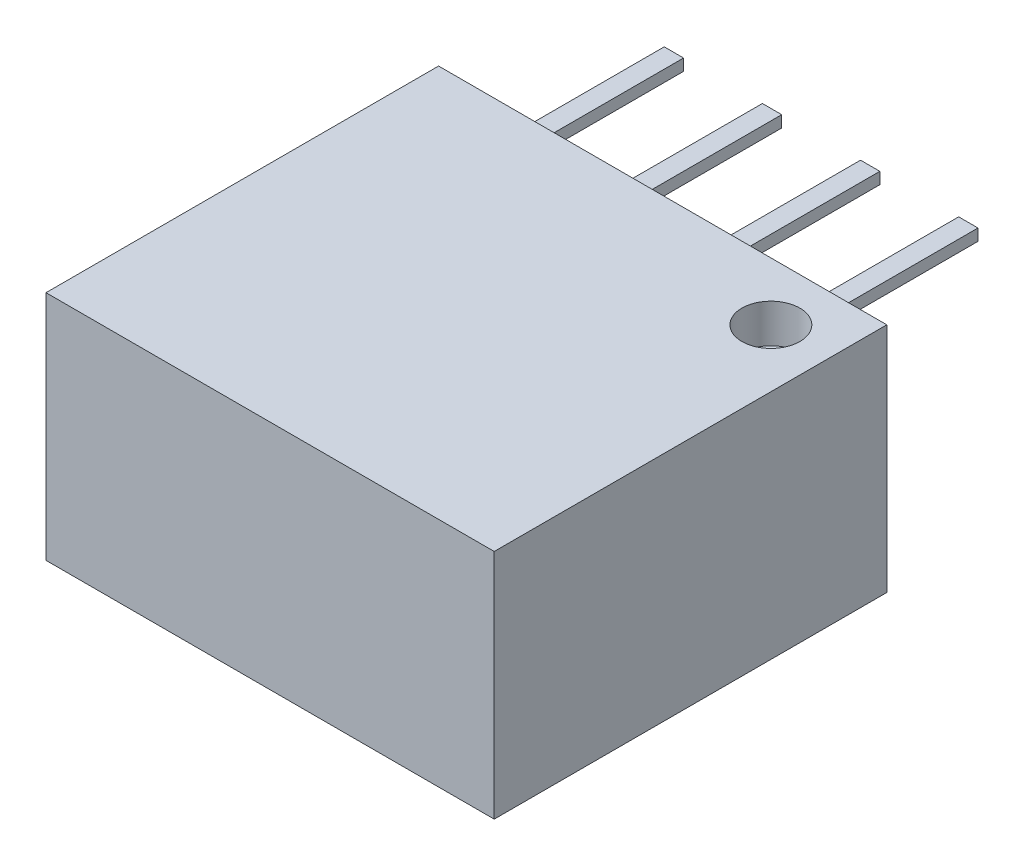
ISO-10303-21;
HEADER;
FILE_DESCRIPTION(('STEP AP214'),'2;1');
FILE_NAME('part.step','',(''),(''),'','','');
FILE_SCHEMA(('AUTOMOTIVE_DESIGN { 1 0 10303 214 1 1 1 1 }'));
ENDSEC;
DATA;
#1=APPLICATION_CONTEXT('core data for automotive mechanical design processes');
#2=APPLICATION_PROTOCOL_DEFINITION('international standard','automotive_design',2000,#1);
#3=PRODUCT_CONTEXT('',#1,'mechanical');
#4=PRODUCT('Part','Part','',(#3));
#5=PRODUCT_RELATED_PRODUCT_CATEGORY('part','',(#4));
#6=PRODUCT_DEFINITION_FORMATION('','',#4);
#7=PRODUCT_DEFINITION_CONTEXT('part definition',#1,'design');
#8=PRODUCT_DEFINITION('design','',#6,#7);
#9=PRODUCT_DEFINITION_SHAPE('','',#8);
#10=(LENGTH_UNIT() NAMED_UNIT(*) SI_UNIT(.MILLI.,.METRE.));
#11=(NAMED_UNIT(*) PLANE_ANGLE_UNIT() SI_UNIT($,.RADIAN.));
#12=(NAMED_UNIT(*) SI_UNIT($,.STERADIAN.) SOLID_ANGLE_UNIT());
#13=UNCERTAINTY_MEASURE_WITH_UNIT(LENGTH_MEASURE(1.E-05),#10,'distance_accuracy_value','');
#14=(GEOMETRIC_REPRESENTATION_CONTEXT(3) GLOBAL_UNCERTAINTY_ASSIGNED_CONTEXT((#13)) GLOBAL_UNIT_ASSIGNED_CONTEXT((#10,
#11,#12)) REPRESENTATION_CONTEXT('',''));
#15=CARTESIAN_POINT('',(0.,0.,0.));
#16=DIRECTION('',(0.,0.,1.));
#17=DIRECTION('',(1.,0.,0.));
#18=AXIS2_PLACEMENT_3D('',#15,#16,#17);
#19=CARTESIAN_POINT('',(-3.56,2.25,-4.1));
#20=DIRECTION('',(0.,-1.,0.));
#21=DIRECTION('',(0.,0.,-1.));
#22=AXIS2_PLACEMENT_3D('',#19,#20,#21);
#23=PLANE('',#22);
#24=DIRECTION('',(1.,0.,0.));
#25=VECTOR('',#24,1.);
#26=CARTESIAN_POINT('',(-3.56,2.25,0.));
#27=LINE('',#26,#25);
#28=CARTESIAN_POINT('',(-4.06,2.25,0.));
#29=VERTEX_POINT('',#28);
#30=CARTESIAN_POINT('',(-3.56,2.25,0.));
#31=VERTEX_POINT('',#30);
#32=EDGE_CURVE('E12',#29,#31,#27,.T.);
#33=ORIENTED_EDGE('',*,*,#32,.T.);
#34=DIRECTION('',(0.,0.,1.));
#35=VECTOR('',#34,1.);
#36=CARTESIAN_POINT('',(-3.56,2.25,-4.1));
#37=LINE('',#36,#35);
#38=CARTESIAN_POINT('',(-3.56,2.25,-4.1));
#39=VERTEX_POINT('',#38);
#40=EDGE_CURVE('E133',#39,#31,#37,.T.);
#41=ORIENTED_EDGE('',*,*,#40,.F.);
#42=DIRECTION('',(1.,0.,0.));
#43=VECTOR('',#42,1.);
#44=CARTESIAN_POINT('',(-3.56,2.25,-4.1));
#45=LINE('',#44,#43);
#46=CARTESIAN_POINT('',(-4.06,2.25,-4.1));
#47=VERTEX_POINT('',#46);
#48=EDGE_CURVE('E66',#47,#39,#45,.T.);
#49=ORIENTED_EDGE('',*,*,#48,.F.);
#50=DIRECTION('',(0.,0.,1.));
#51=VECTOR('',#50,1.);
#52=CARTESIAN_POINT('',(-4.06,2.25,-4.1));
#53=LINE('',#52,#51);
#54=EDGE_CURVE('E121',#47,#29,#53,.T.);
#55=ORIENTED_EDGE('',*,*,#54,.T.);
#56=EDGE_LOOP('',(#33,#41,#49,#55));
#57=FACE_BOUND('',#56,.T.);
#58=ADVANCED_FACE('F62',(#57),#23,.F.);
#59=CARTESIAN_POINT('',(-3.56,1.95,-4.1));
#60=DIRECTION('',(-1.,0.,0.));
#61=DIRECTION('',(0.,0.,1.));
#62=AXIS2_PLACEMENT_3D('',#59,#60,#61);
#63=PLANE('',#62);
#64=DIRECTION('',(0.,-1.,0.));
#65=VECTOR('',#64,1.);
#66=CARTESIAN_POINT('',(-3.56,1.95,0.));
#67=LINE('',#66,#65);
#68=CARTESIAN_POINT('',(-3.56,1.95,0.));
#69=VERTEX_POINT('',#68);
#70=EDGE_CURVE('E72',#31,#69,#67,.T.);
#71=ORIENTED_EDGE('',*,*,#70,.T.);
#72=DIRECTION('',(0.,0.,1.));
#73=VECTOR('',#72,1.);
#74=CARTESIAN_POINT('',(-3.56,1.95,-4.1));
#75=LINE('',#74,#73);
#76=CARTESIAN_POINT('',(-3.56,1.95,-4.1));
#77=VERTEX_POINT('',#76);
#78=EDGE_CURVE('E117',#77,#69,#75,.T.);
#79=ORIENTED_EDGE('',*,*,#78,.F.);
#80=DIRECTION('',(0.,-1.,0.));
#81=VECTOR('',#80,1.);
#82=CARTESIAN_POINT('',(-3.56,1.95,-4.1));
#83=LINE('',#82,#81);
#84=EDGE_CURVE('E96',#39,#77,#83,.T.);
#85=ORIENTED_EDGE('',*,*,#84,.F.);
#86=ORIENTED_EDGE('',*,*,#40,.T.);
#87=EDGE_LOOP('',(#71,#79,#85,#86));
#88=FACE_BOUND('',#87,.T.);
#89=ADVANCED_FACE('F136',(#88),#63,.F.);
#90=CARTESIAN_POINT('',(-3.56,1.95,-4.1));
#91=DIRECTION('',(0.,1.,0.));
#92=DIRECTION('',(0.,0.,1.));
#93=AXIS2_PLACEMENT_3D('',#90,#91,#92);
#94=PLANE('',#93);
#95=DIRECTION('',(-1.,0.,0.));
#96=VECTOR('',#95,1.);
#97=CARTESIAN_POINT('',(-3.56,1.95,0.));
#98=LINE('',#97,#96);
#99=CARTESIAN_POINT('',(-4.06,1.95,0.));
#100=VERTEX_POINT('',#99);
#101=EDGE_CURVE('E112',#69,#100,#98,.T.);
#102=ORIENTED_EDGE('',*,*,#101,.T.);
#103=DIRECTION('',(0.,0.,1.));
#104=VECTOR('',#103,1.);
#105=CARTESIAN_POINT('',(-4.06,1.95,-4.1));
#106=LINE('',#105,#104);
#107=CARTESIAN_POINT('',(-4.06,1.95,-4.1));
#108=VERTEX_POINT('',#107);
#109=EDGE_CURVE('E115',#108,#100,#106,.T.);
#110=ORIENTED_EDGE('',*,*,#109,.F.);
#111=DIRECTION('',(-1.,0.,0.));
#112=VECTOR('',#111,1.);
#113=CARTESIAN_POINT('',(-3.56,1.95,-4.1));
#114=LINE('',#113,#112);
#115=EDGE_CURVE('E129',#77,#108,#114,.T.);
#116=ORIENTED_EDGE('',*,*,#115,.F.);
#117=ORIENTED_EDGE('',*,*,#78,.T.);
#118=EDGE_LOOP('',(#102,#110,#116,#117));
#119=FACE_BOUND('',#118,.T.);
#120=ADVANCED_FACE('F113',(#119),#94,.F.);
#121=CARTESIAN_POINT('',(-4.06,1.95,-4.1));
#122=DIRECTION('',(1.,0.,0.));
#123=DIRECTION('',(0.,0.,-1.));
#124=AXIS2_PLACEMENT_3D('',#121,#122,#123);
#125=PLANE('',#124);
#126=DIRECTION('',(0.,1.,0.));
#127=VECTOR('',#126,1.);
#128=CARTESIAN_POINT('',(-4.06,1.95,0.));
#129=LINE('',#128,#127);
#130=EDGE_CURVE('E106',#100,#29,#129,.T.);
#131=ORIENTED_EDGE('',*,*,#130,.T.);
#132=ORIENTED_EDGE('',*,*,#54,.F.);
#133=DIRECTION('',(0.,1.,0.));
#134=VECTOR('',#133,1.);
#135=CARTESIAN_POINT('',(-4.06,1.95,-4.1));
#136=LINE('',#135,#134);
#137=EDGE_CURVE('E120',#108,#47,#136,.T.);
#138=ORIENTED_EDGE('',*,*,#137,.F.);
#139=ORIENTED_EDGE('',*,*,#109,.T.);
#140=EDGE_LOOP('',(#131,#132,#138,#139));
#141=FACE_BOUND('',#140,.T.);
#142=ADVANCED_FACE('F119',(#141),#125,.F.);
#143=CARTESIAN_POINT('',(0.,0.,-4.1));
#144=DIRECTION('',(0.,0.,-1.));
#145=DIRECTION('',(-1.,0.,0.));
#146=AXIS2_PLACEMENT_3D('',#143,#144,#145);
#147=PLANE('',#146);
#148=ORIENTED_EDGE('',*,*,#48,.T.);
#149=ORIENTED_EDGE('',*,*,#84,.T.);
#150=ORIENTED_EDGE('',*,*,#115,.T.);
#151=ORIENTED_EDGE('',*,*,#137,.T.);
#152=EDGE_LOOP('',(#148,#149,#150,#151));
#153=FACE_BOUND('',#152,.T.);
#154=ADVANCED_FACE('F64',(#153),#147,.T.);
#155=CARTESIAN_POINT('',(0.,0.,0.));
#156=DIRECTION('',(0.,0.,-1.));
#157=DIRECTION('',(-1.,0.,0.));
#158=AXIS2_PLACEMENT_3D('',#155,#156,#157);
#159=PLANE('',#158);
#160=ORIENTED_EDGE('',*,*,#32,.F.);
#161=ORIENTED_EDGE('',*,*,#130,.F.);
#162=ORIENTED_EDGE('',*,*,#101,.F.);
#163=ORIENTED_EDGE('',*,*,#70,.F.);
#164=EDGE_LOOP('',(#160,#161,#162,#163));
#165=FACE_BOUND('',#164,.T.);
#166=ADVANCED_FACE('F123',(#165),#159,.F.);
#167=CLOSED_SHELL('',(#58,#89,#120,#142,#154,#166));
#168=MANIFOLD_SOLID_BREP('B2',#167);
#169=CARTESIAN_POINT('',(-1.02,2.25,-4.1));
#170=DIRECTION('',(0.,-1.,0.));
#171=DIRECTION('',(0.,0.,-1.));
#172=AXIS2_PLACEMENT_3D('',#169,#170,#171);
#173=PLANE('',#172);
#174=DIRECTION('',(1.,0.,0.));
#175=VECTOR('',#174,1.);
#176=CARTESIAN_POINT('',(-1.02,2.25,0.));
#177=LINE('',#176,#175);
#178=CARTESIAN_POINT('',(-1.52,2.25,0.));
#179=VERTEX_POINT('',#178);
#180=CARTESIAN_POINT('',(-1.02,2.25,0.));
#181=VERTEX_POINT('',#180);
#182=EDGE_CURVE('E60',#179,#181,#177,.T.);
#183=ORIENTED_EDGE('',*,*,#182,.T.);
#184=DIRECTION('',(0.,0.,1.));
#185=VECTOR('',#184,1.);
#186=CARTESIAN_POINT('',(-1.02,2.25,-4.1));
#187=LINE('',#186,#185);
#188=CARTESIAN_POINT('',(-1.02,2.25,-4.1));
#189=VERTEX_POINT('',#188);
#190=EDGE_CURVE('E291',#189,#181,#187,.T.);
#191=ORIENTED_EDGE('',*,*,#190,.F.);
#192=DIRECTION('',(1.,0.,0.));
#193=VECTOR('',#192,1.);
#194=CARTESIAN_POINT('',(-1.02,2.25,-4.1));
#195=LINE('',#194,#193);
#196=CARTESIAN_POINT('',(-1.52,2.25,-4.1));
#197=VERTEX_POINT('',#196);
#198=EDGE_CURVE('E224',#197,#189,#195,.T.);
#199=ORIENTED_EDGE('',*,*,#198,.F.);
#200=DIRECTION('',(0.,0.,1.));
#201=VECTOR('',#200,1.);
#202=CARTESIAN_POINT('',(-1.52,2.25,-4.1));
#203=LINE('',#202,#201);
#204=EDGE_CURVE('E279',#197,#179,#203,.T.);
#205=ORIENTED_EDGE('',*,*,#204,.T.);
#206=EDGE_LOOP('',(#183,#191,#199,#205));
#207=FACE_BOUND('',#206,.T.);
#208=ADVANCED_FACE('F220',(#207),#173,.F.);
#209=CARTESIAN_POINT('',(-1.02,1.95,-4.1));
#210=DIRECTION('',(-1.,0.,0.));
#211=DIRECTION('',(0.,0.,1.));
#212=AXIS2_PLACEMENT_3D('',#209,#210,#211);
#213=PLANE('',#212);
#214=DIRECTION('',(0.,-1.,0.));
#215=VECTOR('',#214,1.);
#216=CARTESIAN_POINT('',(-1.02,1.95,0.));
#217=LINE('',#216,#215);
#218=CARTESIAN_POINT('',(-1.02,1.95,0.));
#219=VERTEX_POINT('',#218);
#220=EDGE_CURVE('E230',#181,#219,#217,.T.);
#221=ORIENTED_EDGE('',*,*,#220,.T.);
#222=DIRECTION('',(0.,0.,1.));
#223=VECTOR('',#222,1.);
#224=CARTESIAN_POINT('',(-1.02,1.95,-4.1));
#225=LINE('',#224,#223);
#226=CARTESIAN_POINT('',(-1.02,1.95,-4.1));
#227=VERTEX_POINT('',#226);
#228=EDGE_CURVE('E275',#227,#219,#225,.T.);
#229=ORIENTED_EDGE('',*,*,#228,.F.);
#230=DIRECTION('',(0.,-1.,0.));
#231=VECTOR('',#230,1.);
#232=CARTESIAN_POINT('',(-1.02,1.95,-4.1));
#233=LINE('',#232,#231);
#234=EDGE_CURVE('E254',#189,#227,#233,.T.);
#235=ORIENTED_EDGE('',*,*,#234,.F.);
#236=ORIENTED_EDGE('',*,*,#190,.T.);
#237=EDGE_LOOP('',(#221,#229,#235,#236));
#238=FACE_BOUND('',#237,.T.);
#239=ADVANCED_FACE('F294',(#238),#213,.F.);
#240=CARTESIAN_POINT('',(-1.02,1.95,-4.1));
#241=DIRECTION('',(0.,1.,0.));
#242=DIRECTION('',(0.,0.,1.));
#243=AXIS2_PLACEMENT_3D('',#240,#241,#242);
#244=PLANE('',#243);
#245=DIRECTION('',(-1.,0.,0.));
#246=VECTOR('',#245,1.);
#247=CARTESIAN_POINT('',(-1.02,1.95,0.));
#248=LINE('',#247,#246);
#249=CARTESIAN_POINT('',(-1.52,1.95,0.));
#250=VERTEX_POINT('',#249);
#251=EDGE_CURVE('E270',#219,#250,#248,.T.);
#252=ORIENTED_EDGE('',*,*,#251,.T.);
#253=DIRECTION('',(0.,0.,1.));
#254=VECTOR('',#253,1.);
#255=CARTESIAN_POINT('',(-1.52,1.95,-4.1));
#256=LINE('',#255,#254);
#257=CARTESIAN_POINT('',(-1.52,1.95,-4.1));
#258=VERTEX_POINT('',#257);
#259=EDGE_CURVE('E273',#258,#250,#256,.T.);
#260=ORIENTED_EDGE('',*,*,#259,.F.);
#261=DIRECTION('',(-1.,0.,0.));
#262=VECTOR('',#261,1.);
#263=CARTESIAN_POINT('',(-1.02,1.95,-4.1));
#264=LINE('',#263,#262);
#265=EDGE_CURVE('E287',#227,#258,#264,.T.);
#266=ORIENTED_EDGE('',*,*,#265,.F.);
#267=ORIENTED_EDGE('',*,*,#228,.T.);
#268=EDGE_LOOP('',(#252,#260,#266,#267));
#269=FACE_BOUND('',#268,.T.);
#270=ADVANCED_FACE('F271',(#269),#244,.F.);
#271=CARTESIAN_POINT('',(-1.52,1.95,-4.1));
#272=DIRECTION('',(1.,0.,0.));
#273=DIRECTION('',(0.,0.,-1.));
#274=AXIS2_PLACEMENT_3D('',#271,#272,#273);
#275=PLANE('',#274);
#276=DIRECTION('',(0.,1.,0.));
#277=VECTOR('',#276,1.);
#278=CARTESIAN_POINT('',(-1.52,1.95,0.));
#279=LINE('',#278,#277);
#280=EDGE_CURVE('E264',#250,#179,#279,.T.);
#281=ORIENTED_EDGE('',*,*,#280,.T.);
#282=ORIENTED_EDGE('',*,*,#204,.F.);
#283=DIRECTION('',(0.,1.,0.));
#284=VECTOR('',#283,1.);
#285=CARTESIAN_POINT('',(-1.52,1.95,-4.1));
#286=LINE('',#285,#284);
#287=EDGE_CURVE('E278',#258,#197,#286,.T.);
#288=ORIENTED_EDGE('',*,*,#287,.F.);
#289=ORIENTED_EDGE('',*,*,#259,.T.);
#290=EDGE_LOOP('',(#281,#282,#288,#289));
#291=FACE_BOUND('',#290,.T.);
#292=ADVANCED_FACE('F277',(#291),#275,.F.);
#293=CARTESIAN_POINT('',(0.,0.,-4.1));
#294=DIRECTION('',(0.,0.,-1.));
#295=DIRECTION('',(-1.,0.,0.));
#296=AXIS2_PLACEMENT_3D('',#293,#294,#295);
#297=PLANE('',#296);
#298=ORIENTED_EDGE('',*,*,#198,.T.);
#299=ORIENTED_EDGE('',*,*,#234,.T.);
#300=ORIENTED_EDGE('',*,*,#265,.T.);
#301=ORIENTED_EDGE('',*,*,#287,.T.);
#302=EDGE_LOOP('',(#298,#299,#300,#301));
#303=FACE_BOUND('',#302,.T.);
#304=ADVANCED_FACE('F222',(#303),#297,.T.);
#305=CARTESIAN_POINT('',(0.,0.,0.));
#306=DIRECTION('',(0.,0.,-1.));
#307=DIRECTION('',(-1.,0.,0.));
#308=AXIS2_PLACEMENT_3D('',#305,#306,#307);
#309=PLANE('',#308);
#310=ORIENTED_EDGE('',*,*,#182,.F.);
#311=ORIENTED_EDGE('',*,*,#280,.F.);
#312=ORIENTED_EDGE('',*,*,#251,.F.);
#313=ORIENTED_EDGE('',*,*,#220,.F.);
#314=EDGE_LOOP('',(#310,#311,#312,#313));
#315=FACE_BOUND('',#314,.T.);
#316=ADVANCED_FACE('F281',(#315),#309,.F.);
#317=CLOSED_SHELL('',(#208,#239,#270,#292,#304,#316));
#318=MANIFOLD_SOLID_BREP('B6',#317);
#319=CARTESIAN_POINT('',(3.56,1.95,-4.1));
#320=DIRECTION('',(1.,0.,0.));
#321=DIRECTION('',(0.,0.,-1.));
#322=AXIS2_PLACEMENT_3D('',#319,#320,#321);
#323=PLANE('',#322);
#324=DIRECTION('',(0.,1.,0.));
#325=VECTOR('',#324,1.);
#326=CARTESIAN_POINT('',(3.56,1.95,0.));
#327=LINE('',#326,#325);
#328=CARTESIAN_POINT('',(3.56,1.95,0.));
#329=VERTEX_POINT('',#328);
#330=CARTESIAN_POINT('',(3.56,2.25,0.));
#331=VERTEX_POINT('',#330);
#332=EDGE_CURVE('E218',#329,#331,#327,.T.);
#333=ORIENTED_EDGE('',*,*,#332,.T.);
#334=DIRECTION('',(0.,0.,1.));
#335=VECTOR('',#334,1.);
#336=CARTESIAN_POINT('',(3.56,2.25,-4.1));
#337=LINE('',#336,#335);
#338=CARTESIAN_POINT('',(3.56,2.25,-4.1));
#339=VERTEX_POINT('',#338);
#340=EDGE_CURVE('E449',#339,#331,#337,.T.);
#341=ORIENTED_EDGE('',*,*,#340,.F.);
#342=DIRECTION('',(0.,1.,0.));
#343=VECTOR('',#342,1.);
#344=CARTESIAN_POINT('',(3.56,1.95,-4.1));
#345=LINE('',#344,#343);
#346=CARTESIAN_POINT('',(3.56,1.95,-4.1));
#347=VERTEX_POINT('',#346);
#348=EDGE_CURVE('E382',#347,#339,#345,.T.);
#349=ORIENTED_EDGE('',*,*,#348,.F.);
#350=DIRECTION('',(0.,0.,1.));
#351=VECTOR('',#350,1.);
#352=CARTESIAN_POINT('',(3.56,1.95,-4.1));
#353=LINE('',#352,#351);
#354=EDGE_CURVE('E437',#347,#329,#353,.T.);
#355=ORIENTED_EDGE('',*,*,#354,.T.);
#356=EDGE_LOOP('',(#333,#341,#349,#355));
#357=FACE_BOUND('',#356,.T.);
#358=ADVANCED_FACE('F378',(#357),#323,.F.);
#359=CARTESIAN_POINT('',(4.06,2.25,-4.1));
#360=DIRECTION('',(0.,-1.,0.));
#361=DIRECTION('',(0.,0.,-1.));
#362=AXIS2_PLACEMENT_3D('',#359,#360,#361);
#363=PLANE('',#362);
#364=DIRECTION('',(1.,0.,0.));
#365=VECTOR('',#364,1.);
#366=CARTESIAN_POINT('',(4.06,2.25,0.));
#367=LINE('',#366,#365);
#368=CARTESIAN_POINT('',(4.06,2.25,0.));
#369=VERTEX_POINT('',#368);
#370=EDGE_CURVE('E388',#331,#369,#367,.T.);
#371=ORIENTED_EDGE('',*,*,#370,.T.);
#372=DIRECTION('',(0.,0.,1.));
#373=VECTOR('',#372,1.);
#374=CARTESIAN_POINT('',(4.06,2.25,-4.1));
#375=LINE('',#374,#373);
#376=CARTESIAN_POINT('',(4.06,2.25,-4.1));
#377=VERTEX_POINT('',#376);
#378=EDGE_CURVE('E433',#377,#369,#375,.T.);
#379=ORIENTED_EDGE('',*,*,#378,.F.);
#380=DIRECTION('',(1.,0.,0.));
#381=VECTOR('',#380,1.);
#382=CARTESIAN_POINT('',(4.06,2.25,-4.1));
#383=LINE('',#382,#381);
#384=EDGE_CURVE('E412',#339,#377,#383,.T.);
#385=ORIENTED_EDGE('',*,*,#384,.F.);
#386=ORIENTED_EDGE('',*,*,#340,.T.);
#387=EDGE_LOOP('',(#371,#379,#385,#386));
#388=FACE_BOUND('',#387,.T.);
#389=ADVANCED_FACE('F452',(#388),#363,.F.);
#390=CARTESIAN_POINT('',(4.06,1.95,-4.1));
#391=DIRECTION('',(-1.,0.,0.));
#392=DIRECTION('',(0.,0.,1.));
#393=AXIS2_PLACEMENT_3D('',#390,#391,#392);
#394=PLANE('',#393);
#395=DIRECTION('',(0.,-1.,0.));
#396=VECTOR('',#395,1.);
#397=CARTESIAN_POINT('',(4.06,1.95,0.));
#398=LINE('',#397,#396);
#399=CARTESIAN_POINT('',(4.06,1.95,0.));
#400=VERTEX_POINT('',#399);
#401=EDGE_CURVE('E428',#369,#400,#398,.T.);
#402=ORIENTED_EDGE('',*,*,#401,.T.);
#403=DIRECTION('',(0.,0.,1.));
#404=VECTOR('',#403,1.);
#405=CARTESIAN_POINT('',(4.06,1.95,-4.1));
#406=LINE('',#405,#404);
#407=CARTESIAN_POINT('',(4.06,1.95,-4.1));
#408=VERTEX_POINT('',#407);
#409=EDGE_CURVE('E431',#408,#400,#406,.T.);
#410=ORIENTED_EDGE('',*,*,#409,.F.);
#411=DIRECTION('',(0.,-1.,0.));
#412=VECTOR('',#411,1.);
#413=CARTESIAN_POINT('',(4.06,1.95,-4.1));
#414=LINE('',#413,#412);
#415=EDGE_CURVE('E445',#377,#408,#414,.T.);
#416=ORIENTED_EDGE('',*,*,#415,.F.);
#417=ORIENTED_EDGE('',*,*,#378,.T.);
#418=EDGE_LOOP('',(#402,#410,#416,#417));
#419=FACE_BOUND('',#418,.T.);
#420=ADVANCED_FACE('F429',(#419),#394,.F.);
#421=CARTESIAN_POINT('',(4.06,1.95,-4.1));
#422=DIRECTION('',(0.,1.,0.));
#423=DIRECTION('',(0.,0.,1.));
#424=AXIS2_PLACEMENT_3D('',#421,#422,#423);
#425=PLANE('',#424);
#426=DIRECTION('',(-1.,0.,0.));
#427=VECTOR('',#426,1.);
#428=CARTESIAN_POINT('',(4.06,1.95,0.));
#429=LINE('',#428,#427);
#430=EDGE_CURVE('E422',#400,#329,#429,.T.);
#431=ORIENTED_EDGE('',*,*,#430,.T.);
#432=ORIENTED_EDGE('',*,*,#354,.F.);
#433=DIRECTION('',(-1.,0.,0.));
#434=VECTOR('',#433,1.);
#435=CARTESIAN_POINT('',(4.06,1.95,-4.1));
#436=LINE('',#435,#434);
#437=EDGE_CURVE('E436',#408,#347,#436,.T.);
#438=ORIENTED_EDGE('',*,*,#437,.F.);
#439=ORIENTED_EDGE('',*,*,#409,.T.);
#440=EDGE_LOOP('',(#431,#432,#438,#439));
#441=FACE_BOUND('',#440,.T.);
#442=ADVANCED_FACE('F435',(#441),#425,.F.);
#443=CARTESIAN_POINT('',(0.,0.,-4.1));
#444=DIRECTION('',(0.,0.,1.));
#445=DIRECTION('',(1.,0.,0.));
#446=AXIS2_PLACEMENT_3D('',#443,#444,#445);
#447=PLANE('',#446);
#448=ORIENTED_EDGE('',*,*,#348,.T.);
#449=ORIENTED_EDGE('',*,*,#384,.T.);
#450=ORIENTED_EDGE('',*,*,#415,.T.);
#451=ORIENTED_EDGE('',*,*,#437,.T.);
#452=EDGE_LOOP('',(#448,#449,#450,#451));
#453=FACE_BOUND('',#452,.T.);
#454=ADVANCED_FACE('F380',(#453),#447,.F.);
#455=CARTESIAN_POINT('',(0.,0.,0.));
#456=DIRECTION('',(0.,0.,1.));
#457=DIRECTION('',(1.,0.,0.));
#458=AXIS2_PLACEMENT_3D('',#455,#456,#457);
#459=PLANE('',#458);
#460=ORIENTED_EDGE('',*,*,#332,.F.);
#461=ORIENTED_EDGE('',*,*,#430,.F.);
#462=ORIENTED_EDGE('',*,*,#401,.F.);
#463=ORIENTED_EDGE('',*,*,#370,.F.);
#464=EDGE_LOOP('',(#460,#461,#462,#463));
#465=FACE_BOUND('',#464,.T.);
#466=ADVANCED_FACE('F439',(#465),#459,.T.);
#467=CLOSED_SHELL('',(#358,#389,#420,#442,#454,#466));
#468=MANIFOLD_SOLID_BREP('B54',#467);
#469=CARTESIAN_POINT('',(1.52,2.25,-4.1));
#470=DIRECTION('',(0.,-1.,0.));
#471=DIRECTION('',(0.,0.,-1.));
#472=AXIS2_PLACEMENT_3D('',#469,#470,#471);
#473=PLANE('',#472);
#474=DIRECTION('',(1.,0.,0.));
#475=VECTOR('',#474,1.);
#476=CARTESIAN_POINT('',(1.52,2.25,0.));
#477=LINE('',#476,#475);
#478=CARTESIAN_POINT('',(1.02,2.25,0.));
#479=VERTEX_POINT('',#478);
#480=CARTESIAN_POINT('',(1.52,2.25,0.));
#481=VERTEX_POINT('',#480);
#482=EDGE_CURVE('E598',#479,#481,#477,.T.);
#483=ORIENTED_EDGE('',*,*,#482,.T.);
#484=DIRECTION('',(0.,0.,1.));
#485=VECTOR('',#484,1.);
#486=CARTESIAN_POINT('',(1.52,2.25,-4.1));
#487=LINE('',#486,#485);
#488=CARTESIAN_POINT('',(1.52,2.25,-4.1));
#489=VERTEX_POINT('',#488);
#490=EDGE_CURVE('E376',#489,#481,#487,.T.);
#491=ORIENTED_EDGE('',*,*,#490,.F.);
#492=DIRECTION('',(1.,0.,0.));
#493=VECTOR('',#492,1.);
#494=CARTESIAN_POINT('',(1.52,2.25,-4.1));
#495=LINE('',#494,#493);
#496=CARTESIAN_POINT('',(1.02,2.25,-4.1));
#497=VERTEX_POINT('',#496);
#498=EDGE_CURVE('E586',#497,#489,#495,.T.);
#499=ORIENTED_EDGE('',*,*,#498,.F.);
#500=DIRECTION('',(0.,0.,1.));
#501=VECTOR('',#500,1.);
#502=CARTESIAN_POINT('',(1.02,2.25,-4.1));
#503=LINE('',#502,#501);
#504=EDGE_CURVE('E594',#497,#479,#503,.T.);
#505=ORIENTED_EDGE('',*,*,#504,.T.);
#506=EDGE_LOOP('',(#483,#491,#499,#505));
#507=FACE_BOUND('',#506,.T.);
#508=ADVANCED_FACE('F535',(#507),#473,.F.);
#509=CARTESIAN_POINT('',(1.52,1.95,-4.1));
#510=DIRECTION('',(-1.,0.,0.));
#511=DIRECTION('',(0.,0.,1.));
#512=AXIS2_PLACEMENT_3D('',#509,#510,#511);
#513=PLANE('',#512);
#514=DIRECTION('',(0.,-1.,0.));
#515=VECTOR('',#514,1.);
#516=CARTESIAN_POINT('',(1.52,1.95,0.));
#517=LINE('',#516,#515);
#518=CARTESIAN_POINT('',(1.52,1.95,0.));
#519=VERTEX_POINT('',#518);
#520=EDGE_CURVE('E590',#481,#519,#517,.T.);
#521=ORIENTED_EDGE('',*,*,#520,.T.);
#522=DIRECTION('',(0.,0.,1.));
#523=VECTOR('',#522,1.);
#524=CARTESIAN_POINT('',(1.52,1.95,-4.1));
#525=LINE('',#524,#523);
#526=CARTESIAN_POINT('',(1.52,1.95,-4.1));
#527=VERTEX_POINT('',#526);
#528=EDGE_CURVE('E543',#527,#519,#525,.T.);
#529=ORIENTED_EDGE('',*,*,#528,.F.);
#530=DIRECTION('',(0.,-1.,0.));
#531=VECTOR('',#530,1.);
#532=CARTESIAN_POINT('',(1.52,1.95,-4.1));
#533=LINE('',#532,#531);
#534=EDGE_CURVE('E581',#489,#527,#533,.T.);
#535=ORIENTED_EDGE('',*,*,#534,.F.);
#536=ORIENTED_EDGE('',*,*,#490,.T.);
#537=EDGE_LOOP('',(#521,#529,#535,#536));
#538=FACE_BOUND('',#537,.T.);
#539=ADVANCED_FACE('F589',(#538),#513,.F.);
#540=CARTESIAN_POINT('',(1.52,1.95,-4.1));
#541=DIRECTION('',(0.,1.,0.));
#542=DIRECTION('',(0.,0.,1.));
#543=AXIS2_PLACEMENT_3D('',#540,#541,#542);
#544=PLANE('',#543);
#545=DIRECTION('',(-1.,0.,0.));
#546=VECTOR('',#545,1.);
#547=CARTESIAN_POINT('',(1.52,1.95,0.));
#548=LINE('',#547,#546);
#549=CARTESIAN_POINT('',(1.02,1.95,0.));
#550=VERTEX_POINT('',#549);
#551=EDGE_CURVE('E568',#519,#550,#548,.T.);
#552=ORIENTED_EDGE('',*,*,#551,.T.);
#553=DIRECTION('',(0.,0.,1.));
#554=VECTOR('',#553,1.);
#555=CARTESIAN_POINT('',(1.02,1.95,-4.1));
#556=LINE('',#555,#554);
#557=CARTESIAN_POINT('',(1.02,1.95,-4.1));
#558=VERTEX_POINT('',#557);
#559=EDGE_CURVE('E591',#558,#550,#556,.T.);
#560=ORIENTED_EDGE('',*,*,#559,.F.);
#561=DIRECTION('',(-1.,0.,0.));
#562=VECTOR('',#561,1.);
#563=CARTESIAN_POINT('',(1.52,1.95,-4.1));
#564=LINE('',#563,#562);
#565=EDGE_CURVE('E584',#527,#558,#564,.T.);
#566=ORIENTED_EDGE('',*,*,#565,.F.);
#567=ORIENTED_EDGE('',*,*,#528,.T.);
#568=EDGE_LOOP('',(#552,#560,#566,#567));
#569=FACE_BOUND('',#568,.T.);
#570=ADVANCED_FACE('F592',(#569),#544,.F.);
#571=CARTESIAN_POINT('',(1.02,1.95,-4.1));
#572=DIRECTION('',(1.,0.,0.));
#573=DIRECTION('',(0.,0.,-1.));
#574=AXIS2_PLACEMENT_3D('',#571,#572,#573);
#575=PLANE('',#574);
#576=DIRECTION('',(0.,1.,0.));
#577=VECTOR('',#576,1.);
#578=CARTESIAN_POINT('',(1.02,1.95,0.));
#579=LINE('',#578,#577);
#580=EDGE_CURVE('E574',#550,#479,#579,.T.);
#581=ORIENTED_EDGE('',*,*,#580,.T.);
#582=ORIENTED_EDGE('',*,*,#504,.F.);
#583=DIRECTION('',(0.,1.,0.));
#584=VECTOR('',#583,1.);
#585=CARTESIAN_POINT('',(1.02,1.95,-4.1));
#586=LINE('',#585,#584);
#587=EDGE_CURVE('E551',#558,#497,#586,.T.);
#588=ORIENTED_EDGE('',*,*,#587,.F.);
#589=ORIENTED_EDGE('',*,*,#559,.T.);
#590=EDGE_LOOP('',(#581,#582,#588,#589));
#591=FACE_BOUND('',#590,.T.);
#592=ADVANCED_FACE('F605',(#591),#575,.F.);
#593=CARTESIAN_POINT('',(0.,0.,-4.1));
#594=DIRECTION('',(0.,0.,-1.));
#595=DIRECTION('',(-1.,0.,0.));
#596=AXIS2_PLACEMENT_3D('',#593,#594,#595);
#597=PLANE('',#596);
#598=ORIENTED_EDGE('',*,*,#498,.T.);
#599=ORIENTED_EDGE('',*,*,#534,.T.);
#600=ORIENTED_EDGE('',*,*,#565,.T.);
#601=ORIENTED_EDGE('',*,*,#587,.T.);
#602=EDGE_LOOP('',(#598,#599,#600,#601));
#603=FACE_BOUND('',#602,.T.);
#604=ADVANCED_FACE('F582',(#603),#597,.T.);
#605=CARTESIAN_POINT('',(0.,0.,0.));
#606=DIRECTION('',(0.,0.,-1.));
#607=DIRECTION('',(-1.,0.,0.));
#608=AXIS2_PLACEMENT_3D('',#605,#606,#607);
#609=PLANE('',#608);
#610=ORIENTED_EDGE('',*,*,#482,.F.);
#611=ORIENTED_EDGE('',*,*,#580,.F.);
#612=ORIENTED_EDGE('',*,*,#551,.F.);
#613=ORIENTED_EDGE('',*,*,#520,.F.);
#614=EDGE_LOOP('',(#610,#611,#612,#613));
#615=FACE_BOUND('',#614,.T.);
#616=ADVANCED_FACE('F608',(#615),#609,.F.);
#617=CLOSED_SHELL('',(#508,#539,#570,#592,#604,#616));
#618=MANIFOLD_SOLID_BREP('B212',#617);
#619=CARTESIAN_POINT('',(5.8,-3.,10.16));
#620=DIRECTION('',(-1.,0.,0.));
#621=DIRECTION('',(0.,0.,1.));
#622=AXIS2_PLACEMENT_3D('',#619,#620,#621);
#623=PLANE('',#622);
#624=DIRECTION('',(0.,1.,0.));
#625=VECTOR('',#624,1.);
#626=CARTESIAN_POINT('',(5.8,-3.,0.));
#627=LINE('',#626,#625);
#628=CARTESIAN_POINT('',(5.8,-3.,0.));
#629=VERTEX_POINT('',#628);
#630=CARTESIAN_POINT('',(5.8,3.,0.));
#631=VERTEX_POINT('',#630);
#632=EDGE_CURVE('E751',#629,#631,#627,.T.);
#633=ORIENTED_EDGE('',*,*,#632,.T.);
#634=DIRECTION('',(0.,0.,-1.));
#635=VECTOR('',#634,1.);
#636=CARTESIAN_POINT('',(5.8,3.,10.16));
#637=LINE('',#636,#635);
#638=CARTESIAN_POINT('',(5.8,3.,10.16));
#639=VERTEX_POINT('',#638);
#640=EDGE_CURVE('E533',#639,#631,#637,.T.);
#641=ORIENTED_EDGE('',*,*,#640,.F.);
#642=DIRECTION('',(0.,1.,0.));
#643=VECTOR('',#642,1.);
#644=CARTESIAN_POINT('',(5.8,-3.,10.16));
#645=LINE('',#644,#643);
#646=CARTESIAN_POINT('',(5.8,-3.,10.16));
#647=VERTEX_POINT('',#646);
#648=EDGE_CURVE('E735',#647,#639,#645,.T.);
#649=ORIENTED_EDGE('',*,*,#648,.F.);
#650=DIRECTION('',(0.,0.,-1.));
#651=VECTOR('',#650,1.);
#652=CARTESIAN_POINT('',(5.8,-3.,10.16));
#653=LINE('',#652,#651);
#654=EDGE_CURVE('E747',#647,#629,#653,.T.);
#655=ORIENTED_EDGE('',*,*,#654,.T.);
#656=EDGE_LOOP('',(#633,#641,#649,#655));
#657=FACE_BOUND('',#656,.T.);
#658=ADVANCED_FACE('F683',(#657),#623,.F.);
#659=CARTESIAN_POINT('',(-5.8,3.,10.16));
#660=DIRECTION('',(0.,-1.,0.));
#661=DIRECTION('',(0.,0.,-1.));
#662=AXIS2_PLACEMENT_3D('',#659,#660,#661);
#663=PLANE('',#662);
#664=CARTESIAN_POINT('',(4.3,3.,1.5));
#665=DIRECTION('',(0.,1.,0.));
#666=DIRECTION('',(0.,0.,1.));
#667=AXIS2_PLACEMENT_3D('',#664,#665,#666);
#668=CIRCLE('',#667,0.75);
#669=CARTESIAN_POINT('',(4.3,3.,2.25));
#670=VERTEX_POINT('',#669);
#671=EDGE_CURVE('E772',#670,#670,#668,.T.);
#672=ORIENTED_EDGE('',*,*,#671,.F.);
#673=EDGE_LOOP('',(#672));
#674=FACE_BOUND('',#673,.T.);
#675=DIRECTION('',(-1.,0.,0.));
#676=VECTOR('',#675,1.);
#677=CARTESIAN_POINT('',(-5.8,3.,0.));
#678=LINE('',#677,#676);
#679=CARTESIAN_POINT('',(-5.8,3.,0.));
#680=VERTEX_POINT('',#679);
#681=EDGE_CURVE('E740',#631,#680,#678,.T.);
#682=ORIENTED_EDGE('',*,*,#681,.T.);
#683=DIRECTION('',(0.,0.,-1.));
#684=VECTOR('',#683,1.);
#685=CARTESIAN_POINT('',(-5.8,3.,10.16));
#686=LINE('',#685,#684);
#687=CARTESIAN_POINT('',(-5.8,3.,10.16));
#688=VERTEX_POINT('',#687);
#689=EDGE_CURVE('E692',#688,#680,#686,.T.);
#690=ORIENTED_EDGE('',*,*,#689,.F.);
#691=DIRECTION('',(-1.,0.,0.));
#692=VECTOR('',#691,1.);
#693=CARTESIAN_POINT('',(-5.8,3.,10.16));
#694=LINE('',#693,#692);
#695=EDGE_CURVE('E730',#639,#688,#694,.T.);
#696=ORIENTED_EDGE('',*,*,#695,.F.);
#697=ORIENTED_EDGE('',*,*,#640,.T.);
#698=EDGE_LOOP('',(#682,#690,#696,#697));
#699=FACE_BOUND('',#698,.T.);
#700=ADVANCED_FACE('F739',(#674,#699),#663,.F.);
#701=CARTESIAN_POINT('',(-5.8,-3.,10.16));
#702=DIRECTION('',(1.,0.,0.));
#703=DIRECTION('',(0.,0.,-1.));
#704=AXIS2_PLACEMENT_3D('',#701,#702,#703);
#705=PLANE('',#704);
#706=DIRECTION('',(0.,-1.,0.));
#707=VECTOR('',#706,1.);
#708=CARTESIAN_POINT('',(-5.8,-3.,0.));
#709=LINE('',#708,#707);
#710=CARTESIAN_POINT('',(-5.8,-3.,0.));
#711=VERTEX_POINT('',#710);
#712=EDGE_CURVE('E717',#680,#711,#709,.T.);
#713=ORIENTED_EDGE('',*,*,#712,.T.);
#714=DIRECTION('',(0.,0.,-1.));
#715=VECTOR('',#714,1.);
#716=CARTESIAN_POINT('',(-5.8,-3.,10.16));
#717=LINE('',#716,#715);
#718=CARTESIAN_POINT('',(-5.8,-3.,10.16));
#719=VERTEX_POINT('',#718);
#720=EDGE_CURVE('E742',#719,#711,#717,.T.);
#721=ORIENTED_EDGE('',*,*,#720,.F.);
#722=DIRECTION('',(0.,-1.,0.));
#723=VECTOR('',#722,1.);
#724=CARTESIAN_POINT('',(-5.8,-3.,10.16));
#725=LINE('',#724,#723);
#726=EDGE_CURVE('E733',#688,#719,#725,.T.);
#727=ORIENTED_EDGE('',*,*,#726,.F.);
#728=ORIENTED_EDGE('',*,*,#689,.T.);
#729=EDGE_LOOP('',(#713,#721,#727,#728));
#730=FACE_BOUND('',#729,.T.);
#731=ADVANCED_FACE('F743',(#730),#705,.F.);
#732=CARTESIAN_POINT('',(-5.8,-3.,10.16));
#733=DIRECTION('',(0.,1.,0.));
#734=DIRECTION('',(0.,0.,1.));
#735=AXIS2_PLACEMENT_3D('',#732,#733,#734);
#736=PLANE('',#735);
#737=DIRECTION('',(1.,0.,0.));
#738=VECTOR('',#737,1.);
#739=CARTESIAN_POINT('',(-5.8,-3.,0.));
#740=LINE('',#739,#738);
#741=EDGE_CURVE('E723',#711,#629,#740,.T.);
#742=ORIENTED_EDGE('',*,*,#741,.T.);
#743=ORIENTED_EDGE('',*,*,#654,.F.);
#744=DIRECTION('',(1.,0.,0.));
#745=VECTOR('',#744,1.);
#746=CARTESIAN_POINT('',(-5.8,-3.,10.16));
#747=LINE('',#746,#745);
#748=EDGE_CURVE('E700',#719,#647,#747,.T.);
#749=ORIENTED_EDGE('',*,*,#748,.F.);
#750=ORIENTED_EDGE('',*,*,#720,.T.);
#751=EDGE_LOOP('',(#742,#743,#749,#750));
#752=FACE_BOUND('',#751,.T.);
#753=ADVANCED_FACE('F765',(#752),#736,.F.);
#754=CARTESIAN_POINT('',(0.,0.,10.16));
#755=DIRECTION('',(0.,0.,-1.));
#756=DIRECTION('',(-1.,0.,0.));
#757=AXIS2_PLACEMENT_3D('',#754,#755,#756);
#758=PLANE('',#757);
#759=ORIENTED_EDGE('',*,*,#648,.T.);
#760=ORIENTED_EDGE('',*,*,#695,.T.);
#761=ORIENTED_EDGE('',*,*,#726,.T.);
#762=ORIENTED_EDGE('',*,*,#748,.T.);
#763=EDGE_LOOP('',(#759,#760,#761,#762));
#764=FACE_BOUND('',#763,.T.);
#765=ADVANCED_FACE('F731',(#764),#758,.F.);
#766=CARTESIAN_POINT('',(0.,0.,0.));
#767=DIRECTION('',(0.,0.,-1.));
#768=DIRECTION('',(-1.,0.,0.));
#769=AXIS2_PLACEMENT_3D('',#766,#767,#768);
#770=PLANE('',#769);
#771=ORIENTED_EDGE('',*,*,#632,.F.);
#772=ORIENTED_EDGE('',*,*,#741,.F.);
#773=ORIENTED_EDGE('',*,*,#712,.F.);
#774=ORIENTED_EDGE('',*,*,#681,.F.);
#775=EDGE_LOOP('',(#771,#772,#773,#774));
#776=FACE_BOUND('',#775,.T.);
#777=ADVANCED_FACE('F768',(#776),#770,.T.);
#778=CARTESIAN_POINT('',(4.3,2.,1.5));
#779=DIRECTION('',(0.,1.,0.));
#780=DIRECTION('',(0.,0.,1.));
#781=AXIS2_PLACEMENT_3D('',#778,#779,#780);
#782=CYLINDRICAL_SURFACE('',#781,0.75);
#783=CARTESIAN_POINT('',(4.3,2.,1.5));
#784=DIRECTION('',(0.,1.,0.));
#785=DIRECTION('',(0.,0.,1.));
#786=AXIS2_PLACEMENT_3D('',#783,#784,#785);
#787=CIRCLE('',#786,0.75);
#788=CARTESIAN_POINT('',(4.3,2.,2.25));
#789=VERTEX_POINT('',#788);
#790=EDGE_CURVE('E755',#789,#789,#787,.T.);
#791=ORIENTED_EDGE('',*,*,#790,.F.);
#792=EDGE_LOOP('',(#791));
#793=FACE_BOUND('',#792,.T.);
#794=ORIENTED_EDGE('',*,*,#671,.T.);
#795=EDGE_LOOP('',(#794));
#796=FACE_BOUND('',#795,.T.);
#797=ADVANCED_FACE('F782',(#793,#796),#782,.F.);
#798=CARTESIAN_POINT('',(4.3,2.,1.5));
#799=DIRECTION('',(0.,1.,0.));
#800=DIRECTION('',(0.,0.,1.));
#801=AXIS2_PLACEMENT_3D('',#798,#799,#800);
#802=PLANE('',#801);
#803=ORIENTED_EDGE('',*,*,#790,.T.);
#804=EDGE_LOOP('',(#803));
#805=FACE_BOUND('',#804,.T.);
#806=ADVANCED_FACE('F780',(#805),#802,.T.);
#807=CLOSED_SHELL('',(#658,#700,#731,#753,#765,#777,#797,#806));
#808=MANIFOLD_SOLID_BREP('B370',#807);
#809=ADVANCED_BREP_SHAPE_REPRESENTATION('',(#18,#168,#318,#468,#618,#808),#14);
#810=SHAPE_DEFINITION_REPRESENTATION(#9,#809);
ENDSEC;
END-ISO-10303-21;
